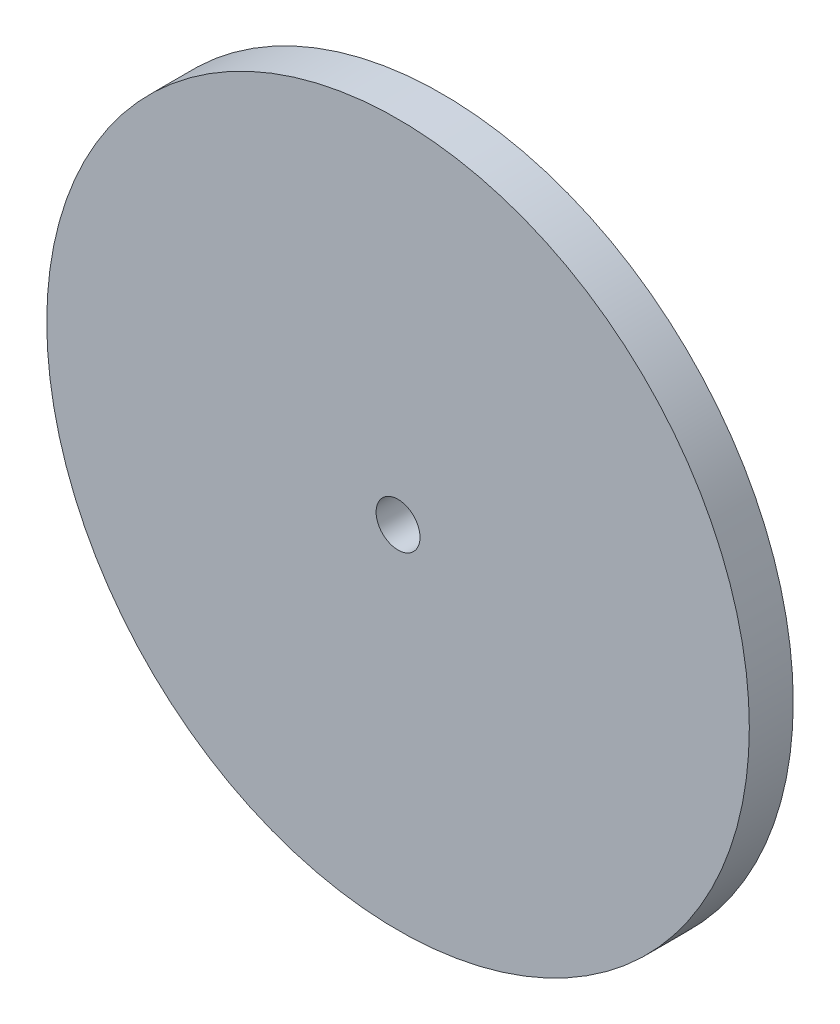
ISO-10303-21;
HEADER;
FILE_DESCRIPTION(('STEP AP214'),'2;1');
FILE_NAME('part.step','',(''),(''),'','','');
FILE_SCHEMA(('AUTOMOTIVE_DESIGN { 1 0 10303 214 1 1 1 1 }'));
ENDSEC;
DATA;
#1=APPLICATION_CONTEXT('core data for automotive mechanical design processes');
#2=APPLICATION_PROTOCOL_DEFINITION('international standard','automotive_design',2000,#1);
#3=PRODUCT_CONTEXT('',#1,'mechanical');
#4=PRODUCT('Part','Part','',(#3));
#5=PRODUCT_RELATED_PRODUCT_CATEGORY('part','',(#4));
#6=PRODUCT_DEFINITION_FORMATION('','',#4);
#7=PRODUCT_DEFINITION_CONTEXT('part definition',#1,'design');
#8=PRODUCT_DEFINITION('design','',#6,#7);
#9=PRODUCT_DEFINITION_SHAPE('','',#8);
#10=(LENGTH_UNIT() NAMED_UNIT(*) SI_UNIT(.MILLI.,.METRE.));
#11=(NAMED_UNIT(*) PLANE_ANGLE_UNIT() SI_UNIT($,.RADIAN.));
#12=(NAMED_UNIT(*) SI_UNIT($,.STERADIAN.) SOLID_ANGLE_UNIT());
#13=UNCERTAINTY_MEASURE_WITH_UNIT(LENGTH_MEASURE(1.E-05),#10,'distance_accuracy_value','');
#14=(GEOMETRIC_REPRESENTATION_CONTEXT(3) GLOBAL_UNCERTAINTY_ASSIGNED_CONTEXT((#13)) GLOBAL_UNIT_ASSIGNED_CONTEXT((#10,
#11,#12)) REPRESENTATION_CONTEXT('',''));
#15=CARTESIAN_POINT('',(0.,0.,0.));
#16=DIRECTION('',(0.,0.,1.));
#17=DIRECTION('',(1.,0.,0.));
#18=AXIS2_PLACEMENT_3D('',#15,#16,#17);
#19=CARTESIAN_POINT('',(0.,0.,6.35));
#20=DIRECTION('',(0.,0.,1.));
#21=DIRECTION('',(1.,0.,0.));
#22=AXIS2_PLACEMENT_3D('',#19,#20,#21);
#23=PLANE('',#22);
#24=CARTESIAN_POINT('',(0.,0.,6.35));
#25=DIRECTION('',(0.,0.,1.));
#26=DIRECTION('',(1.,0.,0.));
#27=AXIS2_PLACEMENT_3D('',#24,#25,#26);
#28=CIRCLE('',#27,50.8);
#29=CARTESIAN_POINT('',(50.8,0.,6.35));
#30=VERTEX_POINT('',#29);
#31=EDGE_CURVE('E10',#30,#30,#28,.T.);
#32=ORIENTED_EDGE('',*,*,#31,.T.);
#33=EDGE_LOOP('',(#32));
#34=FACE_BOUND('',#33,.T.);
#35=CARTESIAN_POINT('',(0.,0.,6.35));
#36=DIRECTION('',(0.,0.,1.));
#37=DIRECTION('',(1.,0.,0.));
#38=AXIS2_PLACEMENT_3D('',#35,#36,#37);
#39=CIRCLE('',#38,3.175);
#40=CARTESIAN_POINT('',(3.175,0.,6.35));
#41=VERTEX_POINT('',#40);
#42=EDGE_CURVE('E54',#41,#41,#39,.T.);
#43=ORIENTED_EDGE('',*,*,#42,.F.);
#44=EDGE_LOOP('',(#43));
#45=FACE_BOUND('',#44,.T.);
#46=ADVANCED_FACE('F41',(#34,#45),#23,.T.);
#47=CARTESIAN_POINT('',(0.,0.,0.));
#48=DIRECTION('',(0.,0.,1.));
#49=DIRECTION('',(1.,0.,0.));
#50=AXIS2_PLACEMENT_3D('',#47,#48,#49);
#51=PLANE('',#50);
#52=CARTESIAN_POINT('',(0.,0.,0.));
#53=DIRECTION('',(0.,0.,1.));
#54=DIRECTION('',(1.,0.,0.));
#55=AXIS2_PLACEMENT_3D('',#52,#53,#54);
#56=CIRCLE('',#55,50.8);
#57=CARTESIAN_POINT('',(50.8,0.,0.));
#58=VERTEX_POINT('',#57);
#59=EDGE_CURVE('E45',#58,#58,#56,.T.);
#60=ORIENTED_EDGE('',*,*,#59,.F.);
#61=EDGE_LOOP('',(#60));
#62=FACE_BOUND('',#61,.T.);
#63=CARTESIAN_POINT('',(0.,0.,0.));
#64=DIRECTION('',(0.,0.,1.));
#65=DIRECTION('',(1.,0.,0.));
#66=AXIS2_PLACEMENT_3D('',#63,#64,#65);
#67=CIRCLE('',#66,3.175);
#68=CARTESIAN_POINT('',(3.175,0.,0.));
#69=VERTEX_POINT('',#68);
#70=EDGE_CURVE('E56',#69,#69,#67,.T.);
#71=ORIENTED_EDGE('',*,*,#70,.T.);
#72=EDGE_LOOP('',(#71));
#73=FACE_BOUND('',#72,.T.);
#74=ADVANCED_FACE('F68',(#62,#73),#51,.F.);
#75=CARTESIAN_POINT('',(0.,0.,6.35));
#76=DIRECTION('',(0.,0.,-1.));
#77=DIRECTION('',(-1.,0.,0.));
#78=AXIS2_PLACEMENT_3D('',#75,#76,#77);
#79=CYLINDRICAL_SURFACE('',#78,50.8);
#80=ORIENTED_EDGE('',*,*,#31,.F.);
#81=EDGE_LOOP('',(#80));
#82=FACE_BOUND('',#81,.T.);
#83=ORIENTED_EDGE('',*,*,#59,.T.);
#84=EDGE_LOOP('',(#83));
#85=FACE_BOUND('',#84,.T.);
#86=ADVANCED_FACE('F43',(#82,#85),#79,.T.);
#87=CARTESIAN_POINT('',(0.,0.,6.35));
#88=DIRECTION('',(0.,0.,-1.));
#89=DIRECTION('',(-1.,0.,0.));
#90=AXIS2_PLACEMENT_3D('',#87,#88,#89);
#91=CYLINDRICAL_SURFACE('',#90,3.175);
#92=ORIENTED_EDGE('',*,*,#42,.T.);
#93=EDGE_LOOP('',(#92));
#94=FACE_BOUND('',#93,.T.);
#95=ORIENTED_EDGE('',*,*,#70,.F.);
#96=EDGE_LOOP('',(#95));
#97=FACE_BOUND('',#96,.T.);
#98=ADVANCED_FACE('F64',(#94,#97),#91,.F.);
#99=CLOSED_SHELL('',(#46,#74,#86,#98));
#100=MANIFOLD_SOLID_BREP('B2',#99);
#101=ADVANCED_BREP_SHAPE_REPRESENTATION('',(#18,#100),#14);
#102=SHAPE_DEFINITION_REPRESENTATION(#9,#101);
ENDSEC;
END-ISO-10303-21;
